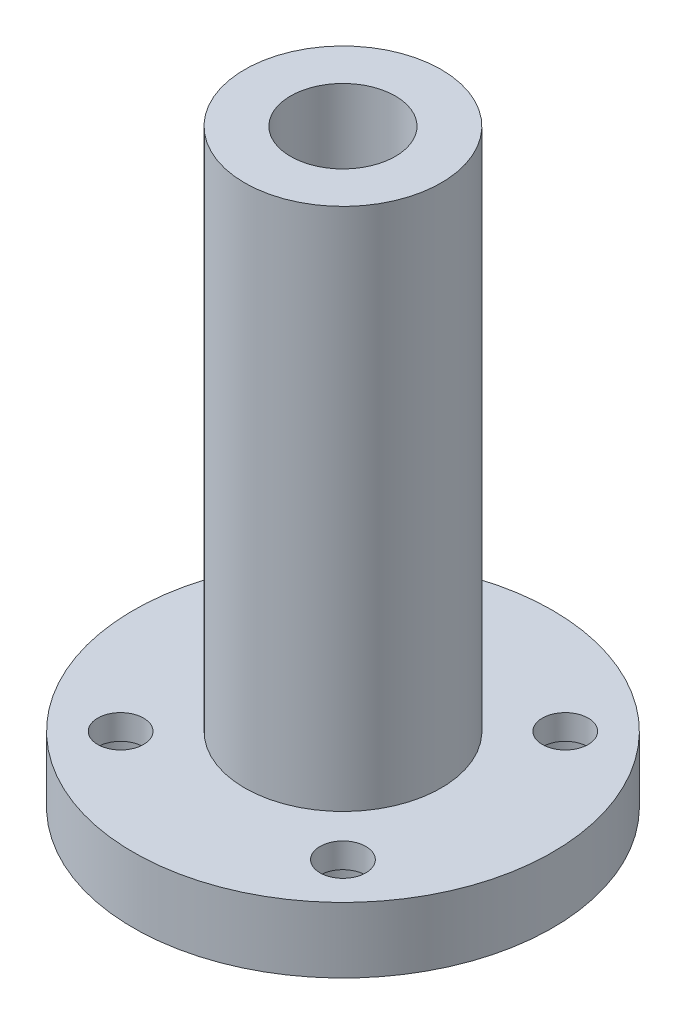
ISO-10303-21;
HEADER;
FILE_DESCRIPTION(('STEP AP214'),'2;1');
FILE_NAME('part.step','',(''),(''),'','','');
FILE_SCHEMA(('AUTOMOTIVE_DESIGN { 1 0 10303 214 1 1 1 1 }'));
ENDSEC;
DATA;
#1=APPLICATION_CONTEXT('core data for automotive mechanical design processes');
#2=APPLICATION_PROTOCOL_DEFINITION('international standard','automotive_design',2000,#1);
#3=PRODUCT_CONTEXT('',#1,'mechanical');
#4=PRODUCT('Part','Part','',(#3));
#5=PRODUCT_RELATED_PRODUCT_CATEGORY('part','',(#4));
#6=PRODUCT_DEFINITION_FORMATION('','',#4);
#7=PRODUCT_DEFINITION_CONTEXT('part definition',#1,'design');
#8=PRODUCT_DEFINITION('design','',#6,#7);
#9=PRODUCT_DEFINITION_SHAPE('','',#8);
#10=(LENGTH_UNIT() NAMED_UNIT(*) SI_UNIT(.MILLI.,.METRE.));
#11=(NAMED_UNIT(*) PLANE_ANGLE_UNIT() SI_UNIT($,.RADIAN.));
#12=(NAMED_UNIT(*) SI_UNIT($,.STERADIAN.) SOLID_ANGLE_UNIT());
#13=UNCERTAINTY_MEASURE_WITH_UNIT(LENGTH_MEASURE(1.E-05),#10,'distance_accuracy_value','');
#14=(GEOMETRIC_REPRESENTATION_CONTEXT(3) GLOBAL_UNCERTAINTY_ASSIGNED_CONTEXT((#13)) GLOBAL_UNIT_ASSIGNED_CONTEXT((#10,
#11,#12)) REPRESENTATION_CONTEXT('',''));
#15=CARTESIAN_POINT('',(0.,0.,0.));
#16=DIRECTION('',(0.,0.,1.));
#17=DIRECTION('',(1.,0.,0.));
#18=AXIS2_PLACEMENT_3D('',#15,#16,#17);
#19=CARTESIAN_POINT('',(0.,45.,0.));
#20=DIRECTION('',(0.,1.,0.));
#21=DIRECTION('',(0.,0.,1.));
#22=AXIS2_PLACEMENT_3D('',#19,#20,#21);
#23=PLANE('',#22);
#24=CARTESIAN_POINT('',(0.,45.,0.));
#25=DIRECTION('',(0.,1.,0.));
#26=DIRECTION('',(0.,0.,1.));
#27=AXIS2_PLACEMENT_3D('',#24,#25,#26);
#28=CIRCLE('',#27,7.5);
#29=CARTESIAN_POINT('',(0.,45.,7.5));
#30=VERTEX_POINT('',#29);
#31=EDGE_CURVE('E52',#30,#30,#28,.T.);
#32=ORIENTED_EDGE('',*,*,#31,.T.);
#33=EDGE_LOOP('',(#32));
#34=FACE_BOUND('',#33,.T.);
#35=CARTESIAN_POINT('',(0.,45.,0.));
#36=DIRECTION('',(0.,-1.,0.));
#37=DIRECTION('',(0.,0.,-1.));
#38=AXIS2_PLACEMENT_3D('',#35,#36,#37);
#39=CIRCLE('',#38,3.99999999999998);
#40=CARTESIAN_POINT('',(0.,45.,-3.99999999999998));
#41=VERTEX_POINT('',#40);
#42=EDGE_CURVE('E288',#41,#41,#39,.T.);
#43=ORIENTED_EDGE('',*,*,#42,.T.);
#44=EDGE_LOOP('',(#43));
#45=FACE_BOUND('',#44,.T.);
#46=ADVANCED_FACE('F35',(#34,#45),#23,.T.);
#47=CARTESIAN_POINT('',(0.,5.,0.));
#48=DIRECTION('',(0.,-1.,0.));
#49=DIRECTION('',(0.,0.,-1.));
#50=AXIS2_PLACEMENT_3D('',#47,#48,#49);
#51=CYLINDRICAL_SURFACE('',#50,16.);
#52=CARTESIAN_POINT('',(0.,5.,0.));
#53=DIRECTION('',(0.,-1.,0.));
#54=DIRECTION('',(0.,0.,-1.));
#55=AXIS2_PLACEMENT_3D('',#52,#53,#54);
#56=CIRCLE('',#55,16.);
#57=CARTESIAN_POINT('',(0.,5.,-16.));
#58=VERTEX_POINT('',#57);
#59=EDGE_CURVE('E43',#58,#58,#56,.T.);
#60=ORIENTED_EDGE('',*,*,#59,.T.);
#61=EDGE_LOOP('',(#60));
#62=FACE_BOUND('',#61,.T.);
#63=CARTESIAN_POINT('',(0.,0.,0.));
#64=DIRECTION('',(0.,-1.,0.));
#65=DIRECTION('',(0.,0.,-1.));
#66=AXIS2_PLACEMENT_3D('',#63,#64,#65);
#67=CIRCLE('',#66,16.);
#68=CARTESIAN_POINT('',(0.,0.,-16.));
#69=VERTEX_POINT('',#68);
#70=EDGE_CURVE('E48',#69,#69,#67,.T.);
#71=ORIENTED_EDGE('',*,*,#70,.F.);
#72=EDGE_LOOP('',(#71));
#73=FACE_BOUND('',#72,.T.);
#74=ADVANCED_FACE('F37',(#62,#73),#51,.T.);
#75=CARTESIAN_POINT('',(16.,5.,0.));
#76=DIRECTION('',(0.,1.,0.));
#77=DIRECTION('',(0.,0.,1.));
#78=AXIS2_PLACEMENT_3D('',#75,#76,#77);
#79=PLANE('',#78);
#80=CARTESIAN_POINT('',(-8.48528137423855,5.,-8.48528137423859));
#81=DIRECTION('',(0.,1.,0.));
#82=DIRECTION('',(0.,0.,1.));
#83=AXIS2_PLACEMENT_3D('',#80,#81,#82);
#84=CIRCLE('',#83,1.75);
#85=CARTESIAN_POINT('',(-8.48528137423855,5.,-6.73528137423859));
#86=VERTEX_POINT('',#85);
#87=EDGE_CURVE('E39',#86,#86,#84,.T.);
#88=ORIENTED_EDGE('',*,*,#87,.F.);
#89=EDGE_LOOP('',(#88));
#90=FACE_BOUND('',#89,.T.);
#91=CARTESIAN_POINT('',(8.48528137423862,5.,-8.48528137423853));
#92=DIRECTION('',(0.,1.,0.));
#93=DIRECTION('',(0.,0.,1.));
#94=AXIS2_PLACEMENT_3D('',#91,#92,#93);
#95=CIRCLE('',#94,1.75);
#96=CARTESIAN_POINT('',(8.48528137423862,5.,-6.73528137423853));
#97=VERTEX_POINT('',#96);
#98=EDGE_CURVE('E64',#97,#97,#95,.T.);
#99=ORIENTED_EDGE('',*,*,#98,.F.);
#100=EDGE_LOOP('',(#99));
#101=FACE_BOUND('',#100,.T.);
#102=CARTESIAN_POINT('',(8.48528137423855,5.,8.48528137423859));
#103=DIRECTION('',(0.,1.,0.));
#104=DIRECTION('',(0.,0.,1.));
#105=AXIS2_PLACEMENT_3D('',#102,#103,#104);
#106=CIRCLE('',#105,1.75);
#107=CARTESIAN_POINT('',(8.48528137423855,5.,10.2352813742386));
#108=VERTEX_POINT('',#107);
#109=EDGE_CURVE('E60',#108,#108,#106,.T.);
#110=ORIENTED_EDGE('',*,*,#109,.F.);
#111=EDGE_LOOP('',(#110));
#112=FACE_BOUND('',#111,.T.);
#113=CARTESIAN_POINT('',(-8.48528137423868,5.,8.48528137423847));
#114=DIRECTION('',(0.,1.,0.));
#115=DIRECTION('',(0.,0.,1.));
#116=AXIS2_PLACEMENT_3D('',#113,#114,#115);
#117=CIRCLE('',#116,1.75);
#118=CARTESIAN_POINT('',(-8.48528137423868,5.,10.2352813742385));
#119=VERTEX_POINT('',#118);
#120=EDGE_CURVE('E56',#119,#119,#117,.T.);
#121=ORIENTED_EDGE('',*,*,#120,.F.);
#122=EDGE_LOOP('',(#121));
#123=FACE_BOUND('',#122,.T.);
#124=CARTESIAN_POINT('',(0.,5.,0.));
#125=DIRECTION('',(0.,1.,0.));
#126=DIRECTION('',(0.,0.,1.));
#127=AXIS2_PLACEMENT_3D('',#124,#125,#126);
#128=CIRCLE('',#127,7.5);
#129=CARTESIAN_POINT('',(0.,5.,7.5));
#130=VERTEX_POINT('',#129);
#131=EDGE_CURVE('E10',#130,#130,#128,.T.);
#132=ORIENTED_EDGE('',*,*,#131,.F.);
#133=EDGE_LOOP('',(#132));
#134=FACE_BOUND('',#133,.T.);
#135=ORIENTED_EDGE('',*,*,#59,.F.);
#136=EDGE_LOOP('',(#135));
#137=FACE_BOUND('',#136,.T.);
#138=ADVANCED_FACE('F113',(#90,#101,#112,#123,#134,#137),#79,.T.);
#139=CARTESIAN_POINT('',(0.,0.,0.));
#140=DIRECTION('',(0.,-1.,0.));
#141=DIRECTION('',(0.,0.,-1.));
#142=AXIS2_PLACEMENT_3D('',#139,#140,#141);
#143=PLANE('',#142);
#144=CARTESIAN_POINT('',(0.,0.,0.));
#145=DIRECTION('',(0.,-1.,0.));
#146=DIRECTION('',(0.,0.,-1.));
#147=AXIS2_PLACEMENT_3D('',#144,#145,#146);
#148=CIRCLE('',#147,3.99999999999999);
#149=CARTESIAN_POINT('',(0.,0.,-3.99999999999999));
#150=VERTEX_POINT('',#149);
#151=EDGE_CURVE('E291',#150,#150,#148,.T.);
#152=ORIENTED_EDGE('',*,*,#151,.F.);
#153=EDGE_LOOP('',(#152));
#154=FACE_BOUND('',#153,.T.);
#155=CARTESIAN_POINT('',(-8.48528137423855,0.,-8.48528137423859));
#156=DIRECTION('',(0.,-1.,0.));
#157=DIRECTION('',(0.,0.,-1.));
#158=AXIS2_PLACEMENT_3D('',#155,#156,#157);
#159=CIRCLE('',#158,3.);
#160=CARTESIAN_POINT('',(-8.48528137423855,0.,-11.4852813742386));
#161=VERTEX_POINT('',#160);
#162=EDGE_CURVE('E293',#161,#161,#159,.T.);
#163=ORIENTED_EDGE('',*,*,#162,.F.);
#164=EDGE_LOOP('',(#163));
#165=FACE_BOUND('',#164,.T.);
#166=CARTESIAN_POINT('',(8.48528137423862,0.,-8.48528137423853));
#167=DIRECTION('',(0.,-1.,0.));
#168=DIRECTION('',(0.,0.,-1.));
#169=AXIS2_PLACEMENT_3D('',#166,#167,#168);
#170=CIRCLE('',#169,3.);
#171=CARTESIAN_POINT('',(8.48528137423862,0.,-11.4852813742385));
#172=VERTEX_POINT('',#171);
#173=EDGE_CURVE('E79',#172,#172,#170,.T.);
#174=ORIENTED_EDGE('',*,*,#173,.F.);
#175=EDGE_LOOP('',(#174));
#176=FACE_BOUND('',#175,.T.);
#177=CARTESIAN_POINT('',(8.48528137423855,0.,8.48528137423859));
#178=DIRECTION('',(0.,-1.,0.));
#179=DIRECTION('',(0.,0.,-1.));
#180=AXIS2_PLACEMENT_3D('',#177,#178,#179);
#181=CIRCLE('',#180,3.);
#182=CARTESIAN_POINT('',(8.48528137423855,0.,5.48528137423859));
#183=VERTEX_POINT('',#182);
#184=EDGE_CURVE('E66',#183,#183,#181,.T.);
#185=ORIENTED_EDGE('',*,*,#184,.F.);
#186=EDGE_LOOP('',(#185));
#187=FACE_BOUND('',#186,.T.);
#188=CARTESIAN_POINT('',(-8.48528137423868,0.,8.48528137423847));
#189=DIRECTION('',(0.,-1.,0.));
#190=DIRECTION('',(0.,0.,-1.));
#191=AXIS2_PLACEMENT_3D('',#188,#189,#190);
#192=CIRCLE('',#191,3.);
#193=CARTESIAN_POINT('',(-8.48528137423868,0.,5.48528137423848));
#194=VERTEX_POINT('',#193);
#195=EDGE_CURVE('E62',#194,#194,#192,.T.);
#196=ORIENTED_EDGE('',*,*,#195,.F.);
#197=EDGE_LOOP('',(#196));
#198=FACE_BOUND('',#197,.T.);
#199=ORIENTED_EDGE('',*,*,#70,.T.);
#200=EDGE_LOOP('',(#199));
#201=FACE_BOUND('',#200,.T.);
#202=ADVANCED_FACE('F109',(#154,#165,#176,#187,#198,#201),#143,.T.);
#203=CARTESIAN_POINT('',(0.,45.,0.));
#204=DIRECTION('',(0.,-1.,0.));
#205=DIRECTION('',(0.,0.,-1.));
#206=AXIS2_PLACEMENT_3D('',#203,#204,#205);
#207=CYLINDRICAL_SURFACE('',#206,7.5);
#208=ORIENTED_EDGE('',*,*,#31,.F.);
#209=EDGE_LOOP('',(#208));
#210=FACE_BOUND('',#209,.T.);
#211=ORIENTED_EDGE('',*,*,#131,.T.);
#212=EDGE_LOOP('',(#211));
#213=FACE_BOUND('',#212,.T.);
#214=ADVANCED_FACE('F112',(#210,#213),#207,.T.);
#215=CARTESIAN_POINT('',(-8.48528137423868,0.,8.48528137423847));
#216=DIRECTION('',(0.,-1.,0.));
#217=DIRECTION('',(0.,0.,-1.));
#218=AXIS2_PLACEMENT_3D('',#215,#216,#217);
#219=CYLINDRICAL_SURFACE('',#218,1.75);
#220=ORIENTED_EDGE('',*,*,#120,.T.);
#221=EDGE_LOOP('',(#220));
#222=FACE_BOUND('',#221,.T.);
#223=CARTESIAN_POINT('',(-8.48528137423868,3.1,8.48528137423847));
#224=DIRECTION('',(0.,-1.,0.));
#225=DIRECTION('',(0.,0.,-1.));
#226=AXIS2_PLACEMENT_3D('',#223,#224,#225);
#227=CIRCLE('',#226,1.75000000000001);
#228=CARTESIAN_POINT('',(-8.48528137423868,3.1,6.73528137423846));
#229=VERTEX_POINT('',#228);
#230=EDGE_CURVE('E59',#229,#229,#227,.T.);
#231=ORIENTED_EDGE('',*,*,#230,.T.);
#232=EDGE_LOOP('',(#231));
#233=FACE_BOUND('',#232,.T.);
#234=ADVANCED_FACE('F94',(#222,#233),#219,.F.);
#235=CARTESIAN_POINT('',(-6.73528137423867,3.1,8.48528137423847));
#236=DIRECTION('',(0.,1.,0.));
#237=DIRECTION('',(0.,0.,1.));
#238=AXIS2_PLACEMENT_3D('',#235,#236,#237);
#239=PLANE('',#238);
#240=ORIENTED_EDGE('',*,*,#230,.F.);
#241=EDGE_LOOP('',(#240));
#242=FACE_BOUND('',#241,.T.);
#243=CARTESIAN_POINT('',(-8.48528137423868,3.1,8.48528137423847));
#244=DIRECTION('',(0.,-1.,0.));
#245=DIRECTION('',(0.,0.,-1.));
#246=AXIS2_PLACEMENT_3D('',#243,#244,#245);
#247=CIRCLE('',#246,3.);
#248=CARTESIAN_POINT('',(-8.48528137423868,3.1,5.48528137423848));
#249=VERTEX_POINT('',#248);
#250=EDGE_CURVE('E89',#249,#249,#247,.T.);
#251=ORIENTED_EDGE('',*,*,#250,.T.);
#252=EDGE_LOOP('',(#251));
#253=FACE_BOUND('',#252,.T.);
#254=ADVANCED_FACE('F96',(#242,#253),#239,.F.);
#255=CARTESIAN_POINT('',(-8.48528137423868,0.,8.48528137423847));
#256=DIRECTION('',(0.,-1.,0.));
#257=DIRECTION('',(0.,0.,-1.));
#258=AXIS2_PLACEMENT_3D('',#255,#256,#257);
#259=CYLINDRICAL_SURFACE('',#258,3.);
#260=ORIENTED_EDGE('',*,*,#250,.F.);
#261=EDGE_LOOP('',(#260));
#262=FACE_BOUND('',#261,.T.);
#263=ORIENTED_EDGE('',*,*,#195,.T.);
#264=EDGE_LOOP('',(#263));
#265=FACE_BOUND('',#264,.T.);
#266=ADVANCED_FACE('F99',(#262,#265),#259,.F.);
#267=CARTESIAN_POINT('',(8.48528137423855,0.,8.48528137423859));
#268=DIRECTION('',(0.,-1.,0.));
#269=DIRECTION('',(0.,0.,-1.));
#270=AXIS2_PLACEMENT_3D('',#267,#268,#269);
#271=CYLINDRICAL_SURFACE('',#270,1.75);
#272=ORIENTED_EDGE('',*,*,#109,.T.);
#273=EDGE_LOOP('',(#272));
#274=FACE_BOUND('',#273,.T.);
#275=CARTESIAN_POINT('',(8.48528137423855,3.1,8.48528137423859));
#276=DIRECTION('',(0.,-1.,0.));
#277=DIRECTION('',(0.,0.,-1.));
#278=AXIS2_PLACEMENT_3D('',#275,#276,#277);
#279=CIRCLE('',#278,1.75000000000001);
#280=CARTESIAN_POINT('',(8.48528137423855,3.1,6.73528137423858));
#281=VERTEX_POINT('',#280);
#282=EDGE_CURVE('E63',#281,#281,#279,.T.);
#283=ORIENTED_EDGE('',*,*,#282,.T.);
#284=EDGE_LOOP('',(#283));
#285=FACE_BOUND('',#284,.T.);
#286=ADVANCED_FACE('F105',(#274,#285),#271,.F.);
#287=CARTESIAN_POINT('',(10.2352813742386,3.1,8.48528137423859));
#288=DIRECTION('',(0.,1.,0.));
#289=DIRECTION('',(0.,0.,1.));
#290=AXIS2_PLACEMENT_3D('',#287,#288,#289);
#291=PLANE('',#290);
#292=ORIENTED_EDGE('',*,*,#282,.F.);
#293=EDGE_LOOP('',(#292));
#294=FACE_BOUND('',#293,.T.);
#295=CARTESIAN_POINT('',(8.48528137423855,3.1,8.48528137423859));
#296=DIRECTION('',(0.,-1.,0.));
#297=DIRECTION('',(0.,0.,-1.));
#298=AXIS2_PLACEMENT_3D('',#295,#296,#297);
#299=CIRCLE('',#298,3.);
#300=CARTESIAN_POINT('',(8.48528137423855,3.1,5.48528137423859));
#301=VERTEX_POINT('',#300);
#302=EDGE_CURVE('E71',#301,#301,#299,.T.);
#303=ORIENTED_EDGE('',*,*,#302,.T.);
#304=EDGE_LOOP('',(#303));
#305=FACE_BOUND('',#304,.T.);
#306=ADVANCED_FACE('F162',(#294,#305),#291,.F.);
#307=CARTESIAN_POINT('',(8.48528137423855,0.,8.48528137423859));
#308=DIRECTION('',(0.,-1.,0.));
#309=DIRECTION('',(0.,0.,-1.));
#310=AXIS2_PLACEMENT_3D('',#307,#308,#309);
#311=CYLINDRICAL_SURFACE('',#310,3.);
#312=ORIENTED_EDGE('',*,*,#302,.F.);
#313=EDGE_LOOP('',(#312));
#314=FACE_BOUND('',#313,.T.);
#315=ORIENTED_EDGE('',*,*,#184,.T.);
#316=EDGE_LOOP('',(#315));
#317=FACE_BOUND('',#316,.T.);
#318=ADVANCED_FACE('F170',(#314,#317),#311,.F.);
#319=CARTESIAN_POINT('',(8.48528137423862,0.,-8.48528137423853));
#320=DIRECTION('',(0.,-1.,0.));
#321=DIRECTION('',(0.,0.,-1.));
#322=AXIS2_PLACEMENT_3D('',#319,#320,#321);
#323=CYLINDRICAL_SURFACE('',#322,1.75);
#324=ORIENTED_EDGE('',*,*,#98,.T.);
#325=EDGE_LOOP('',(#324));
#326=FACE_BOUND('',#325,.T.);
#327=CARTESIAN_POINT('',(8.48528137423862,3.1,-8.48528137423853));
#328=DIRECTION('',(0.,-1.,0.));
#329=DIRECTION('',(0.,0.,-1.));
#330=AXIS2_PLACEMENT_3D('',#327,#328,#329);
#331=CIRCLE('',#330,1.75000000000001);
#332=CARTESIAN_POINT('',(8.48528137423862,3.1,-10.2352813742385));
#333=VERTEX_POINT('',#332);
#334=EDGE_CURVE('E67',#333,#333,#331,.T.);
#335=ORIENTED_EDGE('',*,*,#334,.T.);
#336=EDGE_LOOP('',(#335));
#337=FACE_BOUND('',#336,.T.);
#338=ADVANCED_FACE('F178',(#326,#337),#323,.F.);
#339=CARTESIAN_POINT('',(10.2352813742386,3.1,-8.48528137423853));
#340=DIRECTION('',(0.,1.,0.));
#341=DIRECTION('',(0.,0.,1.));
#342=AXIS2_PLACEMENT_3D('',#339,#340,#341);
#343=PLANE('',#342);
#344=ORIENTED_EDGE('',*,*,#334,.F.);
#345=EDGE_LOOP('',(#344));
#346=FACE_BOUND('',#345,.T.);
#347=CARTESIAN_POINT('',(8.48528137423862,3.1,-8.48528137423853));
#348=DIRECTION('',(0.,-1.,0.));
#349=DIRECTION('',(0.,0.,-1.));
#350=AXIS2_PLACEMENT_3D('',#347,#348,#349);
#351=CIRCLE('',#350,3.);
#352=CARTESIAN_POINT('',(8.48528137423862,3.1,-11.4852813742385));
#353=VERTEX_POINT('',#352);
#354=EDGE_CURVE('E74',#353,#353,#351,.T.);
#355=ORIENTED_EDGE('',*,*,#354,.T.);
#356=EDGE_LOOP('',(#355));
#357=FACE_BOUND('',#356,.T.);
#358=ADVANCED_FACE('F186',(#346,#357),#343,.F.);
#359=CARTESIAN_POINT('',(8.48528137423862,0.,-8.48528137423853));
#360=DIRECTION('',(0.,-1.,0.));
#361=DIRECTION('',(0.,0.,-1.));
#362=AXIS2_PLACEMENT_3D('',#359,#360,#361);
#363=CYLINDRICAL_SURFACE('',#362,3.);
#364=ORIENTED_EDGE('',*,*,#354,.F.);
#365=EDGE_LOOP('',(#364));
#366=FACE_BOUND('',#365,.T.);
#367=ORIENTED_EDGE('',*,*,#173,.T.);
#368=EDGE_LOOP('',(#367));
#369=FACE_BOUND('',#368,.T.);
#370=ADVANCED_FACE('F193',(#366,#369),#363,.F.);
#371=CARTESIAN_POINT('',(-8.48528137423855,0.,-8.48528137423859));
#372=DIRECTION('',(0.,-1.,0.));
#373=DIRECTION('',(0.,0.,-1.));
#374=AXIS2_PLACEMENT_3D('',#371,#372,#373);
#375=CYLINDRICAL_SURFACE('',#374,1.75);
#376=ORIENTED_EDGE('',*,*,#87,.T.);
#377=EDGE_LOOP('',(#376));
#378=FACE_BOUND('',#377,.T.);
#379=CARTESIAN_POINT('',(-8.48528137423855,3.1,-8.48528137423859));
#380=DIRECTION('',(0.,-1.,0.));
#381=DIRECTION('',(0.,0.,-1.));
#382=AXIS2_PLACEMENT_3D('',#379,#380,#381);
#383=CIRCLE('',#382,1.75000000000001);
#384=CARTESIAN_POINT('',(-8.48528137423855,3.1,-10.2352813742386));
#385=VERTEX_POINT('',#384);
#386=EDGE_CURVE('E301',#385,#385,#383,.T.);
#387=ORIENTED_EDGE('',*,*,#386,.T.);
#388=EDGE_LOOP('',(#387));
#389=FACE_BOUND('',#388,.T.);
#390=ADVANCED_FACE('F201',(#378,#389),#375,.F.);
#391=CARTESIAN_POINT('',(-6.73528137423854,3.1,-8.48528137423859));
#392=DIRECTION('',(0.,1.,0.));
#393=DIRECTION('',(0.,0.,1.));
#394=AXIS2_PLACEMENT_3D('',#391,#392,#393);
#395=PLANE('',#394);
#396=ORIENTED_EDGE('',*,*,#386,.F.);
#397=EDGE_LOOP('',(#396));
#398=FACE_BOUND('',#397,.T.);
#399=CARTESIAN_POINT('',(-8.48528137423855,3.1,-8.48528137423859));
#400=DIRECTION('',(0.,-1.,0.));
#401=DIRECTION('',(0.,0.,-1.));
#402=AXIS2_PLACEMENT_3D('',#399,#400,#401);
#403=CIRCLE('',#402,3.);
#404=CARTESIAN_POINT('',(-8.48528137423855,3.1,-11.4852813742386));
#405=VERTEX_POINT('',#404);
#406=EDGE_CURVE('E298',#405,#405,#403,.T.);
#407=ORIENTED_EDGE('',*,*,#406,.T.);
#408=EDGE_LOOP('',(#407));
#409=FACE_BOUND('',#408,.T.);
#410=ADVANCED_FACE('F209',(#398,#409),#395,.F.);
#411=CARTESIAN_POINT('',(-8.48528137423855,0.,-8.48528137423859));
#412=DIRECTION('',(0.,-1.,0.));
#413=DIRECTION('',(0.,0.,-1.));
#414=AXIS2_PLACEMENT_3D('',#411,#412,#413);
#415=CYLINDRICAL_SURFACE('',#414,3.);
#416=ORIENTED_EDGE('',*,*,#406,.F.);
#417=EDGE_LOOP('',(#416));
#418=FACE_BOUND('',#417,.T.);
#419=ORIENTED_EDGE('',*,*,#162,.T.);
#420=EDGE_LOOP('',(#419));
#421=FACE_BOUND('',#420,.T.);
#422=ADVANCED_FACE('F217',(#418,#421),#415,.F.);
#423=CARTESIAN_POINT('',(0.,0.,0.));
#424=DIRECTION('',(0.,-1.,0.));
#425=DIRECTION('',(0.,0.,-1.));
#426=AXIS2_PLACEMENT_3D('',#423,#424,#425);
#427=CYLINDRICAL_SURFACE('',#426,3.99999999999999);
#428=ORIENTED_EDGE('',*,*,#42,.F.);
#429=EDGE_LOOP('',(#428));
#430=FACE_BOUND('',#429,.T.);
#431=ORIENTED_EDGE('',*,*,#151,.T.);
#432=EDGE_LOOP('',(#431));
#433=FACE_BOUND('',#432,.T.);
#434=ADVANCED_FACE('F225',(#430,#433),#427,.F.);
#435=CLOSED_SHELL('',(#46,#74,#138,#202,#214,#234,#254,#266,#286,#306,#318,#338,#358,#370,#390,
#410,#422,#434));
#436=MANIFOLD_SOLID_BREP('B2',#435);
#437=ADVANCED_BREP_SHAPE_REPRESENTATION('',(#18,#436),#14);
#438=SHAPE_DEFINITION_REPRESENTATION(#9,#437);
ENDSEC;
END-ISO-10303-21;
